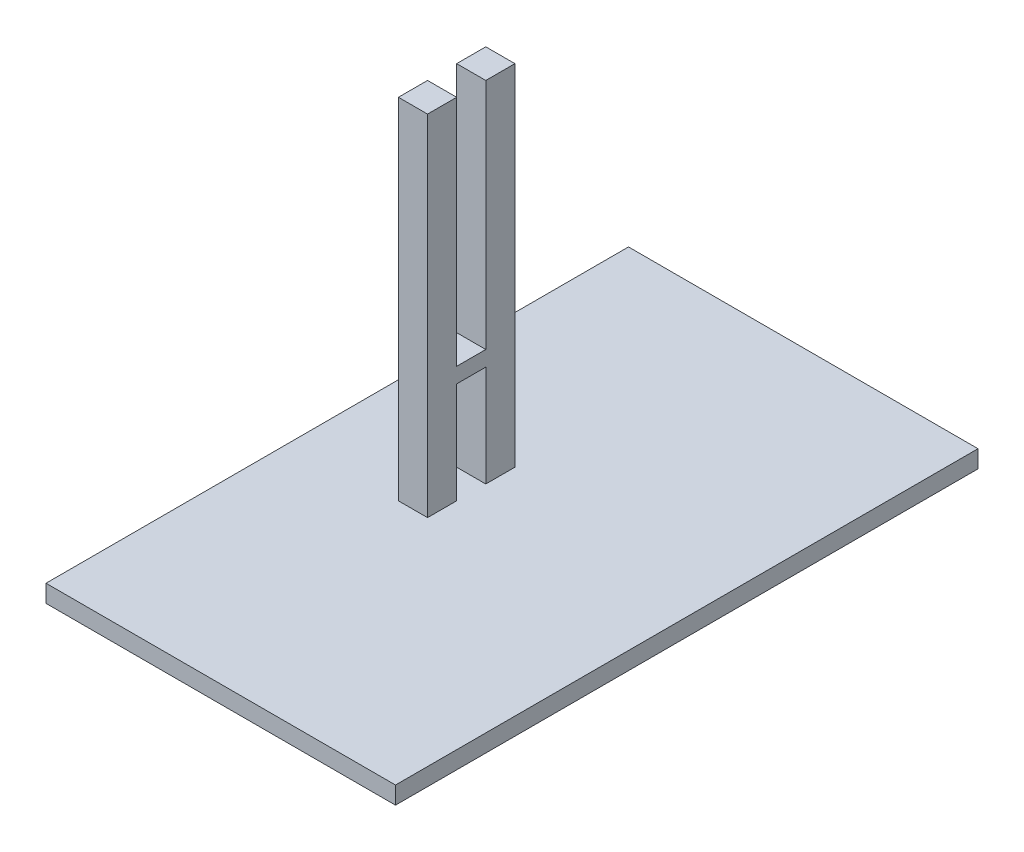
ISO-10303-21;
HEADER;
FILE_DESCRIPTION(('STEP AP214'),'2;1');
FILE_NAME('part.step','',(''),(''),'','','');
FILE_SCHEMA(('AUTOMOTIVE_DESIGN { 1 0 10303 214 1 1 1 1 }'));
ENDSEC;
DATA;
#1=APPLICATION_CONTEXT('core data for automotive mechanical design processes');
#2=APPLICATION_PROTOCOL_DEFINITION('international standard','automotive_design',2000,#1);
#3=PRODUCT_CONTEXT('',#1,'mechanical');
#4=PRODUCT('Part','Part','',(#3));
#5=PRODUCT_RELATED_PRODUCT_CATEGORY('part','',(#4));
#6=PRODUCT_DEFINITION_FORMATION('','',#4);
#7=PRODUCT_DEFINITION_CONTEXT('part definition',#1,'design');
#8=PRODUCT_DEFINITION('design','',#6,#7);
#9=PRODUCT_DEFINITION_SHAPE('','',#8);
#10=(LENGTH_UNIT() NAMED_UNIT(*) SI_UNIT(.MILLI.,.METRE.));
#11=(NAMED_UNIT(*) PLANE_ANGLE_UNIT() SI_UNIT($,.RADIAN.));
#12=(NAMED_UNIT(*) SI_UNIT($,.STERADIAN.) SOLID_ANGLE_UNIT());
#13=UNCERTAINTY_MEASURE_WITH_UNIT(LENGTH_MEASURE(1.E-05),#10,'distance_accuracy_value','');
#14=(GEOMETRIC_REPRESENTATION_CONTEXT(3) GLOBAL_UNCERTAINTY_ASSIGNED_CONTEXT((#13)) GLOBAL_UNIT_ASSIGNED_CONTEXT((#10,
#11,#12)) REPRESENTATION_CONTEXT('',''));
#15=CARTESIAN_POINT('',(0.,0.,0.));
#16=DIRECTION('',(0.,0.,1.));
#17=DIRECTION('',(1.,0.,0.));
#18=AXIS2_PLACEMENT_3D('',#15,#16,#17);
#19=CARTESIAN_POINT('',(-9.5,63.,2.5));
#20=DIRECTION('',(0.,0.,1.));
#21=DIRECTION('',(1.,0.,0.));
#22=AXIS2_PLACEMENT_3D('',#19,#20,#21);
#23=PLANE('',#22);
#24=DIRECTION('',(0.,-1.,0.));
#25=VECTOR('',#24,1.);
#26=CARTESIAN_POINT('',(-7.,63.,2.5));
#27=LINE('',#26,#25);
#28=CARTESIAN_POINT('',(-7.,63.,2.5));
#29=VERTEX_POINT('',#28);
#30=CARTESIAN_POINT('',(-7.,23.,2.5));
#31=VERTEX_POINT('',#30);
#32=EDGE_CURVE('E55',#29,#31,#27,.T.);
#33=ORIENTED_EDGE('',*,*,#32,.T.);
#34=DIRECTION('',(1.,0.,0.));
#35=VECTOR('',#34,1.);
#36=CARTESIAN_POINT('',(-12.,23.,2.5));
#37=LINE('',#36,#35);
#38=CARTESIAN_POINT('',(-12.,23.,2.5));
#39=VERTEX_POINT('',#38);
#40=EDGE_CURVE('E194',#39,#31,#37,.T.);
#41=ORIENTED_EDGE('',*,*,#40,.F.);
#42=DIRECTION('',(0.,-1.,0.));
#43=VECTOR('',#42,1.);
#44=CARTESIAN_POINT('',(-12.,63.,2.5));
#45=LINE('',#44,#43);
#46=CARTESIAN_POINT('',(-12.,63.,2.5));
#47=VERTEX_POINT('',#46);
#48=EDGE_CURVE('E274',#47,#39,#45,.T.);
#49=ORIENTED_EDGE('',*,*,#48,.F.);
#50=DIRECTION('',(-1.,0.,0.));
#51=VECTOR('',#50,1.);
#52=CARTESIAN_POINT('',(-9.5,63.,2.5));
#53=LINE('',#52,#51);
#54=EDGE_CURVE('E237',#29,#47,#53,.T.);
#55=ORIENTED_EDGE('',*,*,#54,.F.);
#56=EDGE_LOOP('',(#33,#41,#49,#55));
#57=FACE_BOUND('',#56,.T.);
#58=ADVANCED_FACE('F39',(#57),#23,.F.);
#59=CARTESIAN_POINT('',(-9.50000000000001,63.,-2.5));
#60=DIRECTION('',(0.,0.,-1.));
#61=DIRECTION('',(-1.,0.,0.));
#62=AXIS2_PLACEMENT_3D('',#59,#60,#61);
#63=PLANE('',#62);
#64=DIRECTION('',(0.,-1.,0.));
#65=VECTOR('',#64,1.);
#66=CARTESIAN_POINT('',(-12.,63.,-2.5));
#67=LINE('',#66,#65);
#68=CARTESIAN_POINT('',(-12.,63.,-2.5));
#69=VERTEX_POINT('',#68);
#70=CARTESIAN_POINT('',(-12.,23.,-2.5));
#71=VERTEX_POINT('',#70);
#72=EDGE_CURVE('E165',#69,#71,#67,.T.);
#73=ORIENTED_EDGE('',*,*,#72,.T.);
#74=DIRECTION('',(1.,0.,0.));
#75=VECTOR('',#74,1.);
#76=CARTESIAN_POINT('',(-12.,23.,-2.5));
#77=LINE('',#76,#75);
#78=CARTESIAN_POINT('',(-7.00000000000001,23.,-2.5));
#79=VERTEX_POINT('',#78);
#80=EDGE_CURVE('E176',#71,#79,#77,.T.);
#81=ORIENTED_EDGE('',*,*,#80,.T.);
#82=DIRECTION('',(0.,-1.,0.));
#83=VECTOR('',#82,1.);
#84=CARTESIAN_POINT('',(-7.00000000000001,63.,-2.5));
#85=LINE('',#84,#83);
#86=CARTESIAN_POINT('',(-7.00000000000001,63.,-2.5));
#87=VERTEX_POINT('',#86);
#88=EDGE_CURVE('E232',#87,#79,#85,.T.);
#89=ORIENTED_EDGE('',*,*,#88,.F.);
#90=DIRECTION('',(1.,0.,0.));
#91=VECTOR('',#90,1.);
#92=CARTESIAN_POINT('',(-9.50000000000001,63.,-2.5));
#93=LINE('',#92,#91);
#94=EDGE_CURVE('E202',#69,#87,#93,.T.);
#95=ORIENTED_EDGE('',*,*,#94,.F.);
#96=EDGE_LOOP('',(#73,#81,#89,#95));
#97=FACE_BOUND('',#96,.T.);
#98=ADVANCED_FACE('F342',(#97),#63,.F.);
#99=CARTESIAN_POINT('',(0.,3.,0.));
#100=DIRECTION('',(0.,1.,0.));
#101=DIRECTION('',(0.,0.,1.));
#102=AXIS2_PLACEMENT_3D('',#99,#100,#101);
#103=PLANE('',#102);
#104=DIRECTION('',(0.,0.,-1.));
#105=VECTOR('',#104,1.);
#106=CARTESIAN_POINT('',(30.,3.,-50.));
#107=LINE('',#106,#105);
#108=CARTESIAN_POINT('',(30.,3.,50.));
#109=VERTEX_POINT('',#108);
#110=CARTESIAN_POINT('',(30.,3.,-50.));
#111=VERTEX_POINT('',#110);
#112=EDGE_CURVE('E279',#109,#111,#107,.T.);
#113=ORIENTED_EDGE('',*,*,#112,.T.);
#114=DIRECTION('',(-1.,0.,0.));
#115=VECTOR('',#114,1.);
#116=CARTESIAN_POINT('',(-30.,3.,-50.));
#117=LINE('',#116,#115);
#118=CARTESIAN_POINT('',(-30.,3.,-50.));
#119=VERTEX_POINT('',#118);
#120=EDGE_CURVE('E283',#111,#119,#117,.T.);
#121=ORIENTED_EDGE('',*,*,#120,.T.);
#122=DIRECTION('',(0.,0.,1.));
#123=VECTOR('',#122,1.);
#124=CARTESIAN_POINT('',(-30.,3.,-50.));
#125=LINE('',#124,#123);
#126=CARTESIAN_POINT('',(-30.,3.,50.));
#127=VERTEX_POINT('',#126);
#128=EDGE_CURVE('E287',#119,#127,#125,.T.);
#129=ORIENTED_EDGE('',*,*,#128,.T.);
#130=DIRECTION('',(1.,0.,0.));
#131=VECTOR('',#130,1.);
#132=CARTESIAN_POINT('',(-30.,3.,50.));
#133=LINE('',#132,#131);
#134=EDGE_CURVE('E290',#127,#109,#133,.T.);
#135=ORIENTED_EDGE('',*,*,#134,.T.);
#136=EDGE_LOOP('',(#113,#121,#129,#135));
#137=FACE_BOUND('',#136,.T.);
#138=DIRECTION('',(1.,0.,0.));
#139=VECTOR('',#138,1.);
#140=CARTESIAN_POINT('',(-12.,3.,7.5));
#141=LINE('',#140,#139);
#142=CARTESIAN_POINT('',(-12.,3.,7.5));
#143=VERTEX_POINT('',#142);
#144=CARTESIAN_POINT('',(-7.,3.,7.5));
#145=VERTEX_POINT('',#144);
#146=EDGE_CURVE('E255',#143,#145,#141,.T.);
#147=ORIENTED_EDGE('',*,*,#146,.F.);
#148=DIRECTION('',(0.,0.,1.));
#149=VECTOR('',#148,1.);
#150=CARTESIAN_POINT('',(-12.,3.,2.5));
#151=LINE('',#150,#149);
#152=CARTESIAN_POINT('',(-12.,3.,2.5));
#153=VERTEX_POINT('',#152);
#154=EDGE_CURVE('E236',#153,#143,#151,.T.);
#155=ORIENTED_EDGE('',*,*,#154,.F.);
#156=DIRECTION('',(-1.,0.,0.));
#157=VECTOR('',#156,1.);
#158=CARTESIAN_POINT('',(-9.5,3.,2.5));
#159=LINE('',#158,#157);
#160=CARTESIAN_POINT('',(-7.,3.,2.5));
#161=VERTEX_POINT('',#160);
#162=EDGE_CURVE('E242',#161,#153,#159,.T.);
#163=ORIENTED_EDGE('',*,*,#162,.F.);
#164=DIRECTION('',(0.,0.,-1.));
#165=VECTOR('',#164,1.);
#166=CARTESIAN_POINT('',(-7.,3.,7.5));
#167=LINE('',#166,#165);
#168=EDGE_CURVE('E258',#145,#161,#167,.T.);
#169=ORIENTED_EDGE('',*,*,#168,.F.);
#170=EDGE_LOOP('',(#147,#155,#163,#169));
#171=FACE_BOUND('',#170,.T.);
#172=DIRECTION('',(0.,0.,-1.));
#173=VECTOR('',#172,1.);
#174=CARTESIAN_POINT('',(-7.00000000000001,3.,-7.50000000000001));
#175=LINE('',#174,#173);
#176=CARTESIAN_POINT('',(-7.00000000000001,3.,-2.5));
#177=VERTEX_POINT('',#176);
#178=CARTESIAN_POINT('',(-7.00000000000001,3.,-7.50000000000001));
#179=VERTEX_POINT('',#178);
#180=EDGE_CURVE('E215',#177,#179,#175,.T.);
#181=ORIENTED_EDGE('',*,*,#180,.F.);
#182=DIRECTION('',(1.,0.,0.));
#183=VECTOR('',#182,1.);
#184=CARTESIAN_POINT('',(-9.50000000000001,3.,-2.5));
#185=LINE('',#184,#183);
#186=CARTESIAN_POINT('',(-12.,3.,-2.5));
#187=VERTEX_POINT('',#186);
#188=EDGE_CURVE('E197',#187,#177,#185,.T.);
#189=ORIENTED_EDGE('',*,*,#188,.F.);
#190=DIRECTION('',(0.,0.,1.));
#191=VECTOR('',#190,1.);
#192=CARTESIAN_POINT('',(-12.,3.,-2.5));
#193=LINE('',#192,#191);
#194=CARTESIAN_POINT('',(-12.,3.,-7.50000000000001));
#195=VERTEX_POINT('',#194);
#196=EDGE_CURVE('E160',#195,#187,#193,.T.);
#197=ORIENTED_EDGE('',*,*,#196,.F.);
#198=DIRECTION('',(-1.,0.,0.));
#199=VECTOR('',#198,1.);
#200=CARTESIAN_POINT('',(-12.,3.,-7.50000000000001));
#201=LINE('',#200,#199);
#202=EDGE_CURVE('E218',#179,#195,#201,.T.);
#203=ORIENTED_EDGE('',*,*,#202,.F.);
#204=EDGE_LOOP('',(#181,#189,#197,#203));
#205=FACE_BOUND('',#204,.T.);
#206=ADVANCED_FACE('F332',(#137,#171,#205),#103,.T.);
#207=CARTESIAN_POINT('',(30.,3.,-50.));
#208=DIRECTION('',(-1.,0.,0.));
#209=DIRECTION('',(0.,0.,1.));
#210=AXIS2_PLACEMENT_3D('',#207,#208,#209);
#211=PLANE('',#210);
#212=DIRECTION('',(0.,0.,-1.));
#213=VECTOR('',#212,1.);
#214=CARTESIAN_POINT('',(30.,0.,-50.));
#215=LINE('',#214,#213);
#216=CARTESIAN_POINT('',(30.,0.,50.));
#217=VERTEX_POINT('',#216);
#218=CARTESIAN_POINT('',(30.,0.,-50.));
#219=VERTEX_POINT('',#218);
#220=EDGE_CURVE('E278',#217,#219,#215,.T.);
#221=ORIENTED_EDGE('',*,*,#220,.T.);
#222=DIRECTION('',(0.,-1.,0.));
#223=VECTOR('',#222,1.);
#224=CARTESIAN_POINT('',(30.,3.,-50.));
#225=LINE('',#224,#223);
#226=EDGE_CURVE('E11',#111,#219,#225,.T.);
#227=ORIENTED_EDGE('',*,*,#226,.F.);
#228=ORIENTED_EDGE('',*,*,#112,.F.);
#229=DIRECTION('',(0.,-1.,0.));
#230=VECTOR('',#229,1.);
#231=CARTESIAN_POINT('',(30.,3.,50.));
#232=LINE('',#231,#230);
#233=EDGE_CURVE('E293',#109,#217,#232,.T.);
#234=ORIENTED_EDGE('',*,*,#233,.T.);
#235=EDGE_LOOP('',(#221,#227,#228,#234));
#236=FACE_BOUND('',#235,.T.);
#237=ADVANCED_FACE('F41',(#236),#211,.F.);
#238=CARTESIAN_POINT('',(-30.,3.,-50.));
#239=DIRECTION('',(0.,0.,1.));
#240=DIRECTION('',(1.,0.,0.));
#241=AXIS2_PLACEMENT_3D('',#238,#239,#240);
#242=PLANE('',#241);
#243=DIRECTION('',(-1.,0.,0.));
#244=VECTOR('',#243,1.);
#245=CARTESIAN_POINT('',(-30.,0.,-50.));
#246=LINE('',#245,#244);
#247=CARTESIAN_POINT('',(-30.,0.,-50.));
#248=VERTEX_POINT('',#247);
#249=EDGE_CURVE('E297',#219,#248,#246,.T.);
#250=ORIENTED_EDGE('',*,*,#249,.T.);
#251=DIRECTION('',(0.,-1.,0.));
#252=VECTOR('',#251,1.);
#253=CARTESIAN_POINT('',(-30.,3.,-50.));
#254=LINE('',#253,#252);
#255=EDGE_CURVE('E48',#119,#248,#254,.T.);
#256=ORIENTED_EDGE('',*,*,#255,.F.);
#257=ORIENTED_EDGE('',*,*,#120,.F.);
#258=ORIENTED_EDGE('',*,*,#226,.T.);
#259=EDGE_LOOP('',(#250,#256,#257,#258));
#260=FACE_BOUND('',#259,.T.);
#261=ADVANCED_FACE('F334',(#260),#242,.F.);
#262=CARTESIAN_POINT('',(-30.,3.,-50.));
#263=DIRECTION('',(1.,0.,0.));
#264=DIRECTION('',(0.,0.,-1.));
#265=AXIS2_PLACEMENT_3D('',#262,#263,#264);
#266=PLANE('',#265);
#267=DIRECTION('',(0.,0.,1.));
#268=VECTOR('',#267,1.);
#269=CARTESIAN_POINT('',(-30.,0.,-50.));
#270=LINE('',#269,#268);
#271=CARTESIAN_POINT('',(-30.,0.,50.));
#272=VERTEX_POINT('',#271);
#273=EDGE_CURVE('E300',#248,#272,#270,.T.);
#274=ORIENTED_EDGE('',*,*,#273,.T.);
#275=DIRECTION('',(0.,-1.,0.));
#276=VECTOR('',#275,1.);
#277=CARTESIAN_POINT('',(-30.,3.,50.));
#278=LINE('',#277,#276);
#279=EDGE_CURVE('E308',#127,#272,#278,.T.);
#280=ORIENTED_EDGE('',*,*,#279,.F.);
#281=ORIENTED_EDGE('',*,*,#128,.F.);
#282=ORIENTED_EDGE('',*,*,#255,.T.);
#283=EDGE_LOOP('',(#274,#280,#281,#282));
#284=FACE_BOUND('',#283,.T.);
#285=ADVANCED_FACE('F317',(#284),#266,.F.);
#286=CARTESIAN_POINT('',(-30.,3.,50.));
#287=DIRECTION('',(0.,0.,-1.));
#288=DIRECTION('',(-1.,0.,0.));
#289=AXIS2_PLACEMENT_3D('',#286,#287,#288);
#290=PLANE('',#289);
#291=DIRECTION('',(1.,0.,0.));
#292=VECTOR('',#291,1.);
#293=CARTESIAN_POINT('',(-30.,0.,50.));
#294=LINE('',#293,#292);
#295=EDGE_CURVE('E284',#272,#217,#294,.T.);
#296=ORIENTED_EDGE('',*,*,#295,.T.);
#297=ORIENTED_EDGE('',*,*,#233,.F.);
#298=ORIENTED_EDGE('',*,*,#134,.F.);
#299=ORIENTED_EDGE('',*,*,#279,.T.);
#300=EDGE_LOOP('',(#296,#297,#298,#299));
#301=FACE_BOUND('',#300,.T.);
#302=ADVANCED_FACE('F326',(#301),#290,.F.);
#303=CARTESIAN_POINT('',(0.,0.,0.));
#304=DIRECTION('',(0.,1.,0.));
#305=DIRECTION('',(0.,0.,1.));
#306=AXIS2_PLACEMENT_3D('',#303,#304,#305);
#307=PLANE('',#306);
#308=ORIENTED_EDGE('',*,*,#220,.F.);
#309=ORIENTED_EDGE('',*,*,#295,.F.);
#310=ORIENTED_EDGE('',*,*,#273,.F.);
#311=ORIENTED_EDGE('',*,*,#249,.F.);
#312=EDGE_LOOP('',(#308,#309,#310,#311));
#313=FACE_BOUND('',#312,.T.);
#314=ADVANCED_FACE('F323',(#313),#307,.F.);
#315=CARTESIAN_POINT('',(-12.,63.,2.5));
#316=DIRECTION('',(1.,0.,0.));
#317=DIRECTION('',(0.,0.,-1.));
#318=AXIS2_PLACEMENT_3D('',#315,#316,#317);
#319=PLANE('',#318);
#320=ORIENTED_EDGE('',*,*,#154,.T.);
#321=DIRECTION('',(0.,-1.,0.));
#322=VECTOR('',#321,1.);
#323=CARTESIAN_POINT('',(-12.,63.,7.5));
#324=LINE('',#323,#322);
#325=CARTESIAN_POINT('',(-12.,63.,7.5));
#326=VERTEX_POINT('',#325);
#327=EDGE_CURVE('E270',#326,#143,#324,.T.);
#328=ORIENTED_EDGE('',*,*,#327,.F.);
#329=DIRECTION('',(0.,0.,1.));
#330=VECTOR('',#329,1.);
#331=CARTESIAN_POINT('',(-12.,63.,2.5));
#332=LINE('',#331,#330);
#333=EDGE_CURVE('E241',#47,#326,#332,.T.);
#334=ORIENTED_EDGE('',*,*,#333,.F.);
#335=ORIENTED_EDGE('',*,*,#48,.T.);
#336=DIRECTION('',(0.,0.,1.));
#337=VECTOR('',#336,1.);
#338=CARTESIAN_POINT('',(-12.,23.,2.5));
#339=LINE('',#338,#337);
#340=EDGE_CURVE('E181',#71,#39,#339,.T.);
#341=ORIENTED_EDGE('',*,*,#340,.F.);
#342=ORIENTED_EDGE('',*,*,#72,.F.);
#343=DIRECTION('',(0.,0.,1.));
#344=VECTOR('',#343,1.);
#345=CARTESIAN_POINT('',(-12.,63.,-2.5));
#346=LINE('',#345,#344);
#347=CARTESIAN_POINT('',(-12.,63.,-7.50000000000001));
#348=VERTEX_POINT('',#347);
#349=EDGE_CURVE('E166',#348,#69,#346,.T.);
#350=ORIENTED_EDGE('',*,*,#349,.F.);
#351=DIRECTION('',(0.,-1.,0.));
#352=VECTOR('',#351,1.);
#353=CARTESIAN_POINT('',(-12.,63.,-7.50000000000001));
#354=LINE('',#353,#352);
#355=EDGE_CURVE('E225',#348,#195,#354,.T.);
#356=ORIENTED_EDGE('',*,*,#355,.T.);
#357=ORIENTED_EDGE('',*,*,#196,.T.);
#358=CARTESIAN_POINT('',(-12.,20.3851351983317,-2.5));
#359=VERTEX_POINT('',#358);
#360=EDGE_CURVE('E154',#359,#187,#67,.T.);
#361=ORIENTED_EDGE('',*,*,#360,.F.);
#362=DIRECTION('',(0.,0.,-1.));
#363=VECTOR('',#362,1.);
#364=CARTESIAN_POINT('',(-12.,20.3851351983317,-2.5));
#365=LINE('',#364,#363);
#366=CARTESIAN_POINT('',(-12.,20.3851351983317,2.5));
#367=VERTEX_POINT('',#366);
#368=EDGE_CURVE('E158',#367,#359,#365,.T.);
#369=ORIENTED_EDGE('',*,*,#368,.F.);
#370=EDGE_CURVE('E63',#367,#153,#45,.T.);
#371=ORIENTED_EDGE('',*,*,#370,.T.);
#372=EDGE_LOOP('',(#320,#328,#334,#335,#341,#342,#350,#356,#357,#361,#369,#371));
#373=FACE_BOUND('',#372,.T.);
#374=ADVANCED_FACE('F156',(#373),#319,.F.);
#375=CARTESIAN_POINT('',(-12.,63.,7.5));
#376=DIRECTION('',(0.,0.,-1.));
#377=DIRECTION('',(-1.,0.,0.));
#378=AXIS2_PLACEMENT_3D('',#375,#376,#377);
#379=PLANE('',#378);
#380=ORIENTED_EDGE('',*,*,#146,.T.);
#381=DIRECTION('',(0.,-1.,0.));
#382=VECTOR('',#381,1.);
#383=CARTESIAN_POINT('',(-7.,63.,7.5));
#384=LINE('',#383,#382);
#385=CARTESIAN_POINT('',(-7.,63.,7.5));
#386=VERTEX_POINT('',#385);
#387=EDGE_CURVE('E266',#386,#145,#384,.T.);
#388=ORIENTED_EDGE('',*,*,#387,.F.);
#389=DIRECTION('',(1.,0.,0.));
#390=VECTOR('',#389,1.);
#391=CARTESIAN_POINT('',(-12.,63.,7.5));
#392=LINE('',#391,#390);
#393=EDGE_CURVE('E245',#326,#386,#392,.T.);
#394=ORIENTED_EDGE('',*,*,#393,.F.);
#395=ORIENTED_EDGE('',*,*,#327,.T.);
#396=EDGE_LOOP('',(#380,#388,#394,#395));
#397=FACE_BOUND('',#396,.T.);
#398=ADVANCED_FACE('F360',(#397),#379,.F.);
#399=CARTESIAN_POINT('',(-7.,63.,7.5));
#400=DIRECTION('',(-1.,0.,0.));
#401=DIRECTION('',(0.,0.,1.));
#402=AXIS2_PLACEMENT_3D('',#399,#400,#401);
#403=PLANE('',#402);
#404=ORIENTED_EDGE('',*,*,#168,.T.);
#405=CARTESIAN_POINT('',(-7.,20.3851351983317,2.5));
#406=VERTEX_POINT('',#405);
#407=EDGE_CURVE('E252',#406,#161,#27,.T.);
#408=ORIENTED_EDGE('',*,*,#407,.F.);
#409=DIRECTION('',(0.,0.,-1.));
#410=VECTOR('',#409,1.);
#411=CARTESIAN_POINT('',(-7.,20.3851351983317,-2.5));
#412=LINE('',#411,#410);
#413=CARTESIAN_POINT('',(-7.00000000000001,20.3851351983317,-2.5));
#414=VERTEX_POINT('',#413);
#415=EDGE_CURVE('E189',#406,#414,#412,.T.);
#416=ORIENTED_EDGE('',*,*,#415,.T.);
#417=EDGE_CURVE('E171',#414,#177,#85,.T.);
#418=ORIENTED_EDGE('',*,*,#417,.T.);
#419=ORIENTED_EDGE('',*,*,#180,.T.);
#420=DIRECTION('',(0.,-1.,0.));
#421=VECTOR('',#420,1.);
#422=CARTESIAN_POINT('',(-7.00000000000001,63.,-7.50000000000001));
#423=LINE('',#422,#421);
#424=CARTESIAN_POINT('',(-7.00000000000001,63.,-7.50000000000001));
#425=VERTEX_POINT('',#424);
#426=EDGE_CURVE('E228',#425,#179,#423,.T.);
#427=ORIENTED_EDGE('',*,*,#426,.F.);
#428=DIRECTION('',(0.,0.,-1.));
#429=VECTOR('',#428,1.);
#430=CARTESIAN_POINT('',(-7.00000000000001,63.,-7.50000000000001));
#431=LINE('',#430,#429);
#432=EDGE_CURVE('E205',#87,#425,#431,.T.);
#433=ORIENTED_EDGE('',*,*,#432,.F.);
#434=ORIENTED_EDGE('',*,*,#88,.T.);
#435=DIRECTION('',(0.,0.,1.));
#436=VECTOR('',#435,1.);
#437=CARTESIAN_POINT('',(-7.,23.,2.5));
#438=LINE('',#437,#436);
#439=EDGE_CURVE('E182',#79,#31,#438,.T.);
#440=ORIENTED_EDGE('',*,*,#439,.T.);
#441=ORIENTED_EDGE('',*,*,#32,.F.);
#442=DIRECTION('',(0.,0.,-1.));
#443=VECTOR('',#442,1.);
#444=CARTESIAN_POINT('',(-7.,63.,7.5));
#445=LINE('',#444,#443);
#446=EDGE_CURVE('E248',#386,#29,#445,.T.);
#447=ORIENTED_EDGE('',*,*,#446,.F.);
#448=ORIENTED_EDGE('',*,*,#387,.T.);
#449=EDGE_LOOP('',(#404,#408,#416,#418,#419,#427,#433,#434,#440,#441,#447,#448));
#450=FACE_BOUND('',#449,.T.);
#451=ADVANCED_FACE('F354',(#450),#403,.F.);
#452=ORIENTED_EDGE('',*,*,#370,.F.);
#453=DIRECTION('',(1.,0.,0.));
#454=VECTOR('',#453,1.);
#455=CARTESIAN_POINT('',(-12.,20.3851351983317,2.5));
#456=LINE('',#455,#454);
#457=EDGE_CURVE('E177',#367,#406,#456,.T.);
#458=ORIENTED_EDGE('',*,*,#457,.T.);
#459=ORIENTED_EDGE('',*,*,#407,.T.);
#460=ORIENTED_EDGE('',*,*,#162,.T.);
#461=EDGE_LOOP('',(#452,#458,#459,#460));
#462=FACE_BOUND('',#461,.T.);
#463=ADVANCED_FACE('F344',(#462),#23,.F.);
#464=CARTESIAN_POINT('',(0.,63.,0.));
#465=DIRECTION('',(0.,1.,0.));
#466=DIRECTION('',(0.,0.,1.));
#467=AXIS2_PLACEMENT_3D('',#464,#465,#466);
#468=PLANE('',#467);
#469=ORIENTED_EDGE('',*,*,#54,.T.);
#470=ORIENTED_EDGE('',*,*,#333,.T.);
#471=ORIENTED_EDGE('',*,*,#393,.T.);
#472=ORIENTED_EDGE('',*,*,#446,.T.);
#473=EDGE_LOOP('',(#469,#470,#471,#472));
#474=FACE_BOUND('',#473,.T.);
#475=ADVANCED_FACE('F353',(#474),#468,.T.);
#476=ORIENTED_EDGE('',*,*,#417,.F.);
#477=DIRECTION('',(1.,0.,0.));
#478=VECTOR('',#477,1.);
#479=CARTESIAN_POINT('',(-12.,20.3851351983317,-2.5));
#480=LINE('',#479,#478);
#481=EDGE_CURVE('E169',#359,#414,#480,.T.);
#482=ORIENTED_EDGE('',*,*,#481,.F.);
#483=ORIENTED_EDGE('',*,*,#360,.T.);
#484=ORIENTED_EDGE('',*,*,#188,.T.);
#485=EDGE_LOOP('',(#476,#482,#483,#484));
#486=FACE_BOUND('',#485,.T.);
#487=ADVANCED_FACE('F170',(#486),#63,.F.);
#488=CARTESIAN_POINT('',(-12.,63.,-7.50000000000001));
#489=DIRECTION('',(0.,0.,1.));
#490=DIRECTION('',(1.,0.,0.));
#491=AXIS2_PLACEMENT_3D('',#488,#489,#490);
#492=PLANE('',#491);
#493=ORIENTED_EDGE('',*,*,#202,.T.);
#494=ORIENTED_EDGE('',*,*,#355,.F.);
#495=DIRECTION('',(-1.,0.,0.));
#496=VECTOR('',#495,1.);
#497=CARTESIAN_POINT('',(-12.,63.,-7.50000000000001));
#498=LINE('',#497,#496);
#499=EDGE_CURVE('E208',#425,#348,#498,.T.);
#500=ORIENTED_EDGE('',*,*,#499,.F.);
#501=ORIENTED_EDGE('',*,*,#426,.T.);
#502=EDGE_LOOP('',(#493,#494,#500,#501));
#503=FACE_BOUND('',#502,.T.);
#504=ADVANCED_FACE('F411',(#503),#492,.F.);
#505=CARTESIAN_POINT('',(0.,63.,0.));
#506=DIRECTION('',(0.,-1.,0.));
#507=DIRECTION('',(0.,0.,-1.));
#508=AXIS2_PLACEMENT_3D('',#505,#506,#507);
#509=PLANE('',#508);
#510=ORIENTED_EDGE('',*,*,#94,.T.);
#511=ORIENTED_EDGE('',*,*,#432,.T.);
#512=ORIENTED_EDGE('',*,*,#499,.T.);
#513=ORIENTED_EDGE('',*,*,#349,.T.);
#514=EDGE_LOOP('',(#510,#511,#512,#513));
#515=FACE_BOUND('',#514,.T.);
#516=ADVANCED_FACE('F416',(#515),#509,.F.);
#517=CARTESIAN_POINT('',(-12.,23.,2.5));
#518=DIRECTION('',(0.,1.,0.));
#519=DIRECTION('',(0.,0.,1.));
#520=AXIS2_PLACEMENT_3D('',#517,#518,#519);
#521=PLANE('',#520);
#522=ORIENTED_EDGE('',*,*,#439,.F.);
#523=ORIENTED_EDGE('',*,*,#80,.F.);
#524=ORIENTED_EDGE('',*,*,#340,.T.);
#525=ORIENTED_EDGE('',*,*,#40,.T.);
#526=EDGE_LOOP('',(#522,#523,#524,#525));
#527=FACE_BOUND('',#526,.T.);
#528=ADVANCED_FACE('F426',(#527),#521,.T.);
#529=CARTESIAN_POINT('',(-12.,20.3851351983317,-2.5));
#530=DIRECTION('',(0.,-1.,0.));
#531=DIRECTION('',(0.,0.,-1.));
#532=AXIS2_PLACEMENT_3D('',#529,#530,#531);
#533=PLANE('',#532);
#534=ORIENTED_EDGE('',*,*,#415,.F.);
#535=ORIENTED_EDGE('',*,*,#457,.F.);
#536=ORIENTED_EDGE('',*,*,#368,.T.);
#537=ORIENTED_EDGE('',*,*,#481,.T.);
#538=EDGE_LOOP('',(#534,#535,#536,#537));
#539=FACE_BOUND('',#538,.T.);
#540=ADVANCED_FACE('F179',(#539),#533,.T.);
#541=CLOSED_SHELL('',(#58,#98,#206,#237,#261,#285,#302,#314,#374,#398,#451,#463,#475,#487,#504,
#516,#528,#540));
#542=MANIFOLD_SOLID_BREP('B2',#541);
#543=ADVANCED_BREP_SHAPE_REPRESENTATION('',(#18,#542),#14);
#544=SHAPE_DEFINITION_REPRESENTATION(#9,#543);
ENDSEC;
END-ISO-10303-21;
